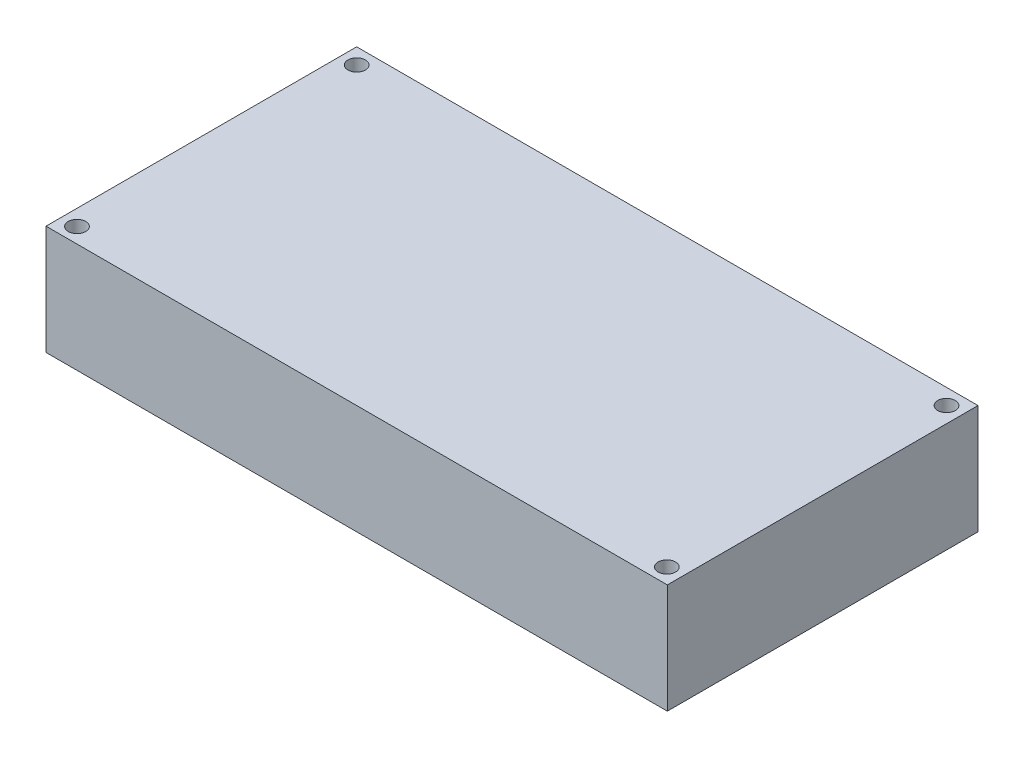
ISO-10303-21;
HEADER;
FILE_DESCRIPTION(('STEP AP214'),'2;1');
FILE_NAME('part.step','',(''),(''),'','','');
FILE_SCHEMA(('AUTOMOTIVE_DESIGN { 1 0 10303 214 1 1 1 1 }'));
ENDSEC;
DATA;
#1=APPLICATION_CONTEXT('core data for automotive mechanical design processes');
#2=APPLICATION_PROTOCOL_DEFINITION('international standard','automotive_design',2000,#1);
#3=PRODUCT_CONTEXT('',#1,'mechanical');
#4=PRODUCT('Part','Part','',(#3));
#5=PRODUCT_RELATED_PRODUCT_CATEGORY('part','',(#4));
#6=PRODUCT_DEFINITION_FORMATION('','',#4);
#7=PRODUCT_DEFINITION_CONTEXT('part definition',#1,'design');
#8=PRODUCT_DEFINITION('design','',#6,#7);
#9=PRODUCT_DEFINITION_SHAPE('','',#8);
#10=(LENGTH_UNIT() NAMED_UNIT(*) SI_UNIT(.MILLI.,.METRE.));
#11=(NAMED_UNIT(*) PLANE_ANGLE_UNIT() SI_UNIT($,.RADIAN.));
#12=(NAMED_UNIT(*) SI_UNIT($,.STERADIAN.) SOLID_ANGLE_UNIT());
#13=UNCERTAINTY_MEASURE_WITH_UNIT(LENGTH_MEASURE(1.E-05),#10,'distance_accuracy_value','');
#14=(GEOMETRIC_REPRESENTATION_CONTEXT(3) GLOBAL_UNCERTAINTY_ASSIGNED_CONTEXT((#13)) GLOBAL_UNIT_ASSIGNED_CONTEXT((#10,
#11,#12)) REPRESENTATION_CONTEXT('',''));
#15=CARTESIAN_POINT('',(0.,0.,0.));
#16=DIRECTION('',(0.,0.,1.));
#17=DIRECTION('',(1.,0.,0.));
#18=AXIS2_PLACEMENT_3D('',#15,#16,#17);
#19=CARTESIAN_POINT('',(0.,25.,0.));
#20=DIRECTION('',(1.,0.,0.));
#21=DIRECTION('',(0.,0.,-1.));
#22=AXIS2_PLACEMENT_3D('',#19,#20,#21);
#23=PLANE('',#22);
#24=DIRECTION('',(0.,0.,1.));
#25=VECTOR('',#24,1.);
#26=CARTESIAN_POINT('',(0.,0.,0.));
#27=LINE('',#26,#25);
#28=CARTESIAN_POINT('',(0.,0.,-71.));
#29=VERTEX_POINT('',#28);
#30=CARTESIAN_POINT('',(0.,0.,0.));
#31=VERTEX_POINT('',#30);
#32=EDGE_CURVE('E98',#29,#31,#27,.T.);
#33=ORIENTED_EDGE('',*,*,#32,.T.);
#34=DIRECTION('',(0.,-1.,0.));
#35=VECTOR('',#34,1.);
#36=CARTESIAN_POINT('',(0.,25.,0.));
#37=LINE('',#36,#35);
#38=CARTESIAN_POINT('',(0.,25.,0.));
#39=VERTEX_POINT('',#38);
#40=EDGE_CURVE('E11',#39,#31,#37,.T.);
#41=ORIENTED_EDGE('',*,*,#40,.F.);
#42=DIRECTION('',(0.,0.,1.));
#43=VECTOR('',#42,1.);
#44=CARTESIAN_POINT('',(0.,25.,0.));
#45=LINE('',#44,#43);
#46=CARTESIAN_POINT('',(0.,25.,-71.));
#47=VERTEX_POINT('',#46);
#48=EDGE_CURVE('E86',#47,#39,#45,.T.);
#49=ORIENTED_EDGE('',*,*,#48,.F.);
#50=DIRECTION('',(0.,-1.,0.));
#51=VECTOR('',#50,1.);
#52=CARTESIAN_POINT('',(0.,25.,-71.));
#53=LINE('',#52,#51);
#54=EDGE_CURVE('E94',#47,#29,#53,.T.);
#55=ORIENTED_EDGE('',*,*,#54,.T.);
#56=EDGE_LOOP('',(#33,#41,#49,#55));
#57=FACE_BOUND('',#56,.T.);
#58=ADVANCED_FACE('F35',(#57),#23,.F.);
#59=CARTESIAN_POINT('',(0.,25.,0.));
#60=DIRECTION('',(0.,0.,-1.));
#61=DIRECTION('',(-1.,0.,0.));
#62=AXIS2_PLACEMENT_3D('',#59,#60,#61);
#63=PLANE('',#62);
#64=DIRECTION('',(1.,0.,0.));
#65=VECTOR('',#64,1.);
#66=CARTESIAN_POINT('',(0.,0.,0.));
#67=LINE('',#66,#65);
#68=CARTESIAN_POINT('',(142.,0.,0.));
#69=VERTEX_POINT('',#68);
#70=EDGE_CURVE('E90',#31,#69,#67,.T.);
#71=ORIENTED_EDGE('',*,*,#70,.T.);
#72=DIRECTION('',(0.,-1.,0.));
#73=VECTOR('',#72,1.);
#74=CARTESIAN_POINT('',(142.,25.,0.));
#75=LINE('',#74,#73);
#76=CARTESIAN_POINT('',(142.,25.,0.));
#77=VERTEX_POINT('',#76);
#78=EDGE_CURVE('E43',#77,#69,#75,.T.);
#79=ORIENTED_EDGE('',*,*,#78,.F.);
#80=DIRECTION('',(1.,0.,0.));
#81=VECTOR('',#80,1.);
#82=CARTESIAN_POINT('',(0.,25.,0.));
#83=LINE('',#82,#81);
#84=EDGE_CURVE('E81',#39,#77,#83,.T.);
#85=ORIENTED_EDGE('',*,*,#84,.F.);
#86=ORIENTED_EDGE('',*,*,#40,.T.);
#87=EDGE_LOOP('',(#71,#79,#85,#86));
#88=FACE_BOUND('',#87,.T.);
#89=ADVANCED_FACE('F89',(#88),#63,.F.);
#90=CARTESIAN_POINT('',(142.,25.,0.));
#91=DIRECTION('',(-1.,0.,0.));
#92=DIRECTION('',(0.,0.,1.));
#93=AXIS2_PLACEMENT_3D('',#90,#91,#92);
#94=PLANE('',#93);
#95=DIRECTION('',(0.,0.,-1.));
#96=VECTOR('',#95,1.);
#97=CARTESIAN_POINT('',(142.,0.,0.));
#98=LINE('',#97,#96);
#99=CARTESIAN_POINT('',(142.,0.,-71.));
#100=VERTEX_POINT('',#99);
#101=EDGE_CURVE('E68',#69,#100,#98,.T.);
#102=ORIENTED_EDGE('',*,*,#101,.T.);
#103=DIRECTION('',(0.,-1.,0.));
#104=VECTOR('',#103,1.);
#105=CARTESIAN_POINT('',(142.,25.,-71.));
#106=LINE('',#105,#104);
#107=CARTESIAN_POINT('',(142.,25.,-71.));
#108=VERTEX_POINT('',#107);
#109=EDGE_CURVE('E91',#108,#100,#106,.T.);
#110=ORIENTED_EDGE('',*,*,#109,.F.);
#111=DIRECTION('',(0.,0.,-1.));
#112=VECTOR('',#111,1.);
#113=CARTESIAN_POINT('',(142.,25.,0.));
#114=LINE('',#113,#112);
#115=EDGE_CURVE('E84',#77,#108,#114,.T.);
#116=ORIENTED_EDGE('',*,*,#115,.F.);
#117=ORIENTED_EDGE('',*,*,#78,.T.);
#118=EDGE_LOOP('',(#102,#110,#116,#117));
#119=FACE_BOUND('',#118,.T.);
#120=ADVANCED_FACE('F92',(#119),#94,.F.);
#121=CARTESIAN_POINT('',(0.,25.,-71.));
#122=DIRECTION('',(0.,0.,1.));
#123=DIRECTION('',(1.,0.,0.));
#124=AXIS2_PLACEMENT_3D('',#121,#122,#123);
#125=PLANE('',#124);
#126=DIRECTION('',(-1.,0.,0.));
#127=VECTOR('',#126,1.);
#128=CARTESIAN_POINT('',(0.,0.,-71.));
#129=LINE('',#128,#127);
#130=EDGE_CURVE('E74',#100,#29,#129,.T.);
#131=ORIENTED_EDGE('',*,*,#130,.T.);
#132=ORIENTED_EDGE('',*,*,#54,.F.);
#133=DIRECTION('',(-1.,0.,0.));
#134=VECTOR('',#133,1.);
#135=CARTESIAN_POINT('',(0.,25.,-71.));
#136=LINE('',#135,#134);
#137=EDGE_CURVE('E51',#108,#47,#136,.T.);
#138=ORIENTED_EDGE('',*,*,#137,.F.);
#139=ORIENTED_EDGE('',*,*,#109,.T.);
#140=EDGE_LOOP('',(#131,#132,#138,#139));
#141=FACE_BOUND('',#140,.T.);
#142=ADVANCED_FACE('F106',(#141),#125,.F.);
#143=CARTESIAN_POINT('',(0.,25.,0.));
#144=DIRECTION('',(0.,-1.,0.));
#145=DIRECTION('',(0.,0.,-1.));
#146=AXIS2_PLACEMENT_3D('',#143,#144,#145);
#147=PLANE('',#146);
#148=CARTESIAN_POINT('',(3.6,25.,-3.48000000000001));
#149=DIRECTION('',(0.,1.,0.));
#150=DIRECTION('',(0.,0.,-1.));
#151=AXIS2_PLACEMENT_3D('',#148,#149,#150);
#152=CIRCLE('',#151,2.);
#153=CARTESIAN_POINT('',(3.6,25.,-5.48000000000001));
#154=VERTEX_POINT('',#153);
#155=EDGE_CURVE('E130',#154,#154,#152,.T.);
#156=ORIENTED_EDGE('',*,*,#155,.F.);
#157=EDGE_LOOP('',(#156));
#158=FACE_BOUND('',#157,.T.);
#159=CARTESIAN_POINT('',(138.4,25.,-3.48000000000001));
#160=DIRECTION('',(0.,1.,0.));
#161=DIRECTION('',(0.,0.,1.));
#162=AXIS2_PLACEMENT_3D('',#159,#160,#161);
#163=CIRCLE('',#162,2.);
#164=CARTESIAN_POINT('',(138.4,25.,-1.48000000000001));
#165=VERTEX_POINT('',#164);
#166=EDGE_CURVE('E124',#165,#165,#163,.T.);
#167=ORIENTED_EDGE('',*,*,#166,.F.);
#168=EDGE_LOOP('',(#167));
#169=FACE_BOUND('',#168,.T.);
#170=CARTESIAN_POINT('',(138.4,25.,-67.4));
#171=DIRECTION('',(0.,1.,0.));
#172=DIRECTION('',(0.,0.,-1.));
#173=AXIS2_PLACEMENT_3D('',#170,#171,#172);
#174=CIRCLE('',#173,2.);
#175=CARTESIAN_POINT('',(138.4,25.,-69.4));
#176=VERTEX_POINT('',#175);
#177=EDGE_CURVE('E118',#176,#176,#174,.T.);
#178=ORIENTED_EDGE('',*,*,#177,.F.);
#179=EDGE_LOOP('',(#178));
#180=FACE_BOUND('',#179,.T.);
#181=CARTESIAN_POINT('',(3.6,25.,-67.4));
#182=DIRECTION('',(0.,1.,0.));
#183=DIRECTION('',(0.,0.,1.));
#184=AXIS2_PLACEMENT_3D('',#181,#182,#183);
#185=CIRCLE('',#184,2.);
#186=CARTESIAN_POINT('',(3.6,25.,-65.4));
#187=VERTEX_POINT('',#186);
#188=EDGE_CURVE('E112',#187,#187,#185,.T.);
#189=ORIENTED_EDGE('',*,*,#188,.F.);
#190=EDGE_LOOP('',(#189));
#191=FACE_BOUND('',#190,.T.);
#192=ORIENTED_EDGE('',*,*,#48,.T.);
#193=ORIENTED_EDGE('',*,*,#84,.T.);
#194=ORIENTED_EDGE('',*,*,#115,.T.);
#195=ORIENTED_EDGE('',*,*,#137,.T.);
#196=EDGE_LOOP('',(#192,#193,#194,#195));
#197=FACE_BOUND('',#196,.T.);
#198=ADVANCED_FACE('F82',(#158,#169,#180,#191,#197),#147,.F.);
#199=CARTESIAN_POINT('',(0.,0.,0.));
#200=DIRECTION('',(0.,-1.,0.));
#201=DIRECTION('',(0.,0.,-1.));
#202=AXIS2_PLACEMENT_3D('',#199,#200,#201);
#203=PLANE('',#202);
#204=CARTESIAN_POINT('',(3.6,0.,-3.48000000000001));
#205=DIRECTION('',(0.,1.,0.));
#206=DIRECTION('',(0.,0.,-1.));
#207=AXIS2_PLACEMENT_3D('',#204,#205,#206);
#208=CIRCLE('',#207,2.);
#209=CARTESIAN_POINT('',(3.6,0.,-5.48000000000001));
#210=VERTEX_POINT('',#209);
#211=EDGE_CURVE('E127',#210,#210,#208,.T.);
#212=ORIENTED_EDGE('',*,*,#211,.T.);
#213=EDGE_LOOP('',(#212));
#214=FACE_BOUND('',#213,.T.);
#215=CARTESIAN_POINT('',(138.4,0.,-3.48000000000001));
#216=DIRECTION('',(0.,1.,0.));
#217=DIRECTION('',(0.,0.,1.));
#218=AXIS2_PLACEMENT_3D('',#215,#216,#217);
#219=CIRCLE('',#218,2.);
#220=CARTESIAN_POINT('',(138.4,0.,-1.48000000000001));
#221=VERTEX_POINT('',#220);
#222=EDGE_CURVE('E121',#221,#221,#219,.T.);
#223=ORIENTED_EDGE('',*,*,#222,.T.);
#224=EDGE_LOOP('',(#223));
#225=FACE_BOUND('',#224,.T.);
#226=CARTESIAN_POINT('',(138.4,0.,-67.4));
#227=DIRECTION('',(0.,1.,0.));
#228=DIRECTION('',(0.,0.,-1.));
#229=AXIS2_PLACEMENT_3D('',#226,#227,#228);
#230=CIRCLE('',#229,2.);
#231=CARTESIAN_POINT('',(138.4,0.,-69.4));
#232=VERTEX_POINT('',#231);
#233=EDGE_CURVE('E115',#232,#232,#230,.T.);
#234=ORIENTED_EDGE('',*,*,#233,.T.);
#235=EDGE_LOOP('',(#234));
#236=FACE_BOUND('',#235,.T.);
#237=CARTESIAN_POINT('',(3.6,0.,-67.4));
#238=DIRECTION('',(0.,1.,0.));
#239=DIRECTION('',(0.,0.,1.));
#240=AXIS2_PLACEMENT_3D('',#237,#238,#239);
#241=CIRCLE('',#240,2.);
#242=CARTESIAN_POINT('',(3.6,0.,-65.4));
#243=VERTEX_POINT('',#242);
#244=EDGE_CURVE('E101',#243,#243,#241,.T.);
#245=ORIENTED_EDGE('',*,*,#244,.T.);
#246=EDGE_LOOP('',(#245));
#247=FACE_BOUND('',#246,.T.);
#248=ORIENTED_EDGE('',*,*,#32,.F.);
#249=ORIENTED_EDGE('',*,*,#130,.F.);
#250=ORIENTED_EDGE('',*,*,#101,.F.);
#251=ORIENTED_EDGE('',*,*,#70,.F.);
#252=EDGE_LOOP('',(#248,#249,#250,#251));
#253=FACE_BOUND('',#252,.T.);
#254=ADVANCED_FACE('F109',(#214,#225,#236,#247,#253),#203,.T.);
#255=CARTESIAN_POINT('',(3.6,0.,-67.4));
#256=DIRECTION('',(0.,1.,0.));
#257=DIRECTION('',(0.,0.,1.));
#258=AXIS2_PLACEMENT_3D('',#255,#256,#257);
#259=CYLINDRICAL_SURFACE('',#258,2.);
#260=ORIENTED_EDGE('',*,*,#244,.F.);
#261=EDGE_LOOP('',(#260));
#262=FACE_BOUND('',#261,.T.);
#263=ORIENTED_EDGE('',*,*,#188,.T.);
#264=EDGE_LOOP('',(#263));
#265=FACE_BOUND('',#264,.T.);
#266=ADVANCED_FACE('F154',(#262,#265),#259,.F.);
#267=CARTESIAN_POINT('',(138.4,0.,-67.4));
#268=DIRECTION('',(0.,1.,0.));
#269=DIRECTION('',(0.,0.,1.));
#270=AXIS2_PLACEMENT_3D('',#267,#268,#269);
#271=CYLINDRICAL_SURFACE('',#270,2.);
#272=ORIENTED_EDGE('',*,*,#233,.F.);
#273=EDGE_LOOP('',(#272));
#274=FACE_BOUND('',#273,.T.);
#275=ORIENTED_EDGE('',*,*,#177,.T.);
#276=EDGE_LOOP('',(#275));
#277=FACE_BOUND('',#276,.T.);
#278=ADVANCED_FACE('F156',(#274,#277),#271,.F.);
#279=CARTESIAN_POINT('',(138.4,0.,-3.48000000000001));
#280=DIRECTION('',(0.,1.,0.));
#281=DIRECTION('',(0.,0.,1.));
#282=AXIS2_PLACEMENT_3D('',#279,#280,#281);
#283=CYLINDRICAL_SURFACE('',#282,2.);
#284=ORIENTED_EDGE('',*,*,#222,.F.);
#285=EDGE_LOOP('',(#284));
#286=FACE_BOUND('',#285,.T.);
#287=ORIENTED_EDGE('',*,*,#166,.T.);
#288=EDGE_LOOP('',(#287));
#289=FACE_BOUND('',#288,.T.);
#290=ADVANCED_FACE('F141',(#286,#289),#283,.F.);
#291=CARTESIAN_POINT('',(3.6,0.,-3.48000000000001));
#292=DIRECTION('',(0.,1.,0.));
#293=DIRECTION('',(0.,0.,1.));
#294=AXIS2_PLACEMENT_3D('',#291,#292,#293);
#295=CYLINDRICAL_SURFACE('',#294,2.);
#296=ORIENTED_EDGE('',*,*,#211,.F.);
#297=EDGE_LOOP('',(#296));
#298=FACE_BOUND('',#297,.T.);
#299=ORIENTED_EDGE('',*,*,#155,.T.);
#300=EDGE_LOOP('',(#299));
#301=FACE_BOUND('',#300,.T.);
#302=ADVANCED_FACE('F138',(#298,#301),#295,.F.);
#303=CLOSED_SHELL('',(#58,#89,#120,#142,#198,#254,#266,#278,#290,#302));
#304=MANIFOLD_SOLID_BREP('B2',#303);
#305=ADVANCED_BREP_SHAPE_REPRESENTATION('',(#18,#304),#14);
#306=SHAPE_DEFINITION_REPRESENTATION(#9,#305);
ENDSEC;
END-ISO-10303-21;
